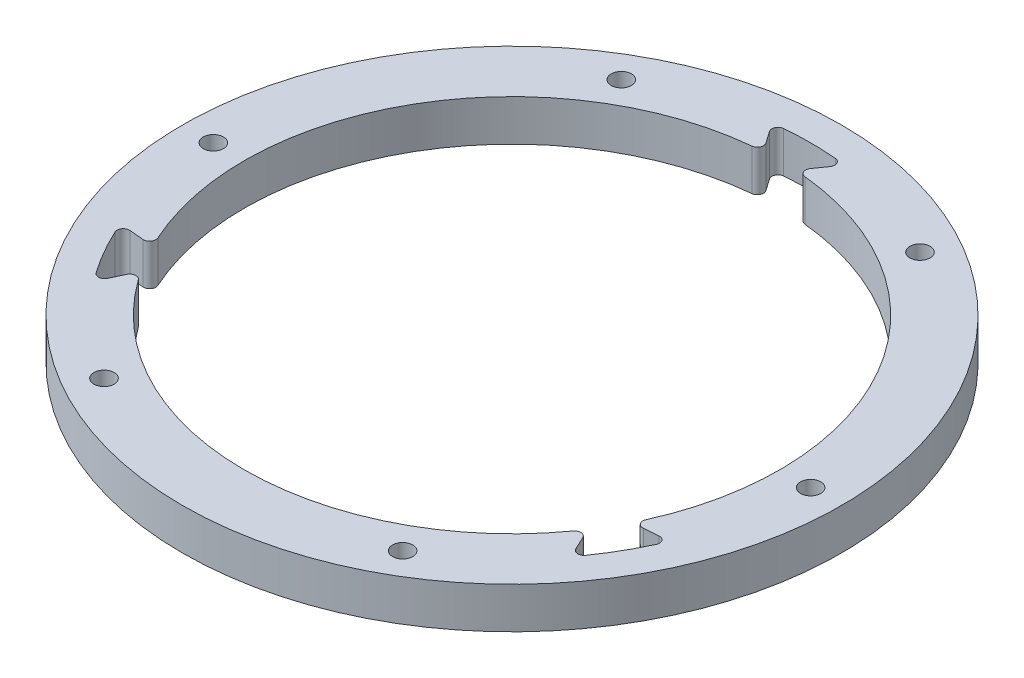
ISO-10303-21;
HEADER;
FILE_DESCRIPTION(('STEP AP214'),'2;1');
FILE_NAME('part.step','',(''),(''),'','','');
FILE_SCHEMA(('AUTOMOTIVE_DESIGN { 1 0 10303 214 1 1 1 1 }'));
ENDSEC;
DATA;
#1=APPLICATION_CONTEXT('core data for automotive mechanical design processes');
#2=APPLICATION_PROTOCOL_DEFINITION('international standard','automotive_design',2000,#1);
#3=PRODUCT_CONTEXT('',#1,'mechanical');
#4=PRODUCT('Part','Part','',(#3));
#5=PRODUCT_RELATED_PRODUCT_CATEGORY('part','',(#4));
#6=PRODUCT_DEFINITION_FORMATION('','',#4);
#7=PRODUCT_DEFINITION_CONTEXT('part definition',#1,'design');
#8=PRODUCT_DEFINITION('design','',#6,#7);
#9=PRODUCT_DEFINITION_SHAPE('','',#8);
#10=(LENGTH_UNIT() NAMED_UNIT(*) SI_UNIT(.MILLI.,.METRE.));
#11=(NAMED_UNIT(*) PLANE_ANGLE_UNIT() SI_UNIT($,.RADIAN.));
#12=(NAMED_UNIT(*) SI_UNIT($,.STERADIAN.) SOLID_ANGLE_UNIT());
#13=UNCERTAINTY_MEASURE_WITH_UNIT(LENGTH_MEASURE(1.E-05),#10,'distance_accuracy_value','');
#14=(GEOMETRIC_REPRESENTATION_CONTEXT(3) GLOBAL_UNCERTAINTY_ASSIGNED_CONTEXT((#13)) GLOBAL_UNIT_ASSIGNED_CONTEXT((#10,
#11,#12)) REPRESENTATION_CONTEXT('',''));
#15=CARTESIAN_POINT('',(0.,0.,0.));
#16=DIRECTION('',(0.,0.,1.));
#17=DIRECTION('',(1.,0.,0.));
#18=AXIS2_PLACEMENT_3D('',#15,#16,#17);
#19=CARTESIAN_POINT('',(0.,10.,80.));
#20=DIRECTION('',(0.,-1.,0.));
#21=DIRECTION('',(0.,0.,-1.));
#22=AXIS2_PLACEMENT_3D('',#19,#20,#21);
#23=PLANE('',#22);
#24=CARTESIAN_POINT('',(-36.2500000000001,10.,-62.7868417743718));
#25=DIRECTION('',(0.,1.,0.));
#26=DIRECTION('',(0.,0.,1.));
#27=AXIS2_PLACEMENT_3D('',#24,#25,#26);
#28=CIRCLE('',#27,2.45744999999999);
#29=CARTESIAN_POINT('',(-36.2500000000001,10.,-60.3293917743718));
#30=VERTEX_POINT('',#29);
#31=EDGE_CURVE('E769',#30,#30,#28,.T.);
#32=ORIENTED_EDGE('',*,*,#31,.F.);
#33=EDGE_LOOP('',(#32));
#34=FACE_BOUND('',#33,.T.);
#35=CARTESIAN_POINT('',(0.,10.,0.));
#36=DIRECTION('',(0.,-1.,0.));
#37=DIRECTION('',(0.,0.,-1.));
#38=AXIS2_PLACEMENT_3D('',#35,#36,#37);
#39=CIRCLE('',#38,80.);
#40=CARTESIAN_POINT('',(0.,10.,-80.));
#41=VERTEX_POINT('',#40);
#42=EDGE_CURVE('E241',#41,#41,#39,.T.);
#43=ORIENTED_EDGE('',*,*,#42,.F.);
#44=EDGE_LOOP('',(#43));
#45=FACE_BOUND('',#44,.T.);
#46=DIRECTION('',(0.422618261740713,0.,0.906307787036644));
#47=VECTOR('',#46,1.);
#48=CARTESIAN_POINT('',(57.9010744784291,10.,43.631589178523));
#49=LINE('',#48,#47);
#50=CARTESIAN_POINT('',(55.3581681828402,10.,38.1783090294255));
#51=VERTEX_POINT('',#50);
#52=CARTESIAN_POINT('',(56.8246262874602,10.,41.3231385834203));
#53=VERTEX_POINT('',#52);
#54=EDGE_CURVE('E359',#51,#53,#49,.T.);
#55=ORIENTED_EDGE('',*,*,#54,.F.);
#56=CARTESIAN_POINT('',(53.9987065022852,10.,38.8122364220365));
#57=DIRECTION('',(0.,-1.,0.));
#58=DIRECTION('',(0.,0.,-1.));
#59=AXIS2_PLACEMENT_3D('',#56,#57,#58);
#60=CIRCLE('',#59,1.5);
#61=CARTESIAN_POINT('',(52.7806905661435,10.,37.9367724425921));
#62=VERTEX_POINT('',#61);
#63=EDGE_CURVE('E324',#51,#62,#60,.F.);
#64=ORIENTED_EDGE('',*,*,#63,.T.);
#65=CARTESIAN_POINT('',(0.,10.,0.));
#66=DIRECTION('',(0.,-1.,0.));
#67=DIRECTION('',(0.,0.,-1.));
#68=AXIS2_PLACEMENT_3D('',#65,#66,#67);
#69=CIRCLE('',#68,65.);
#70=CARTESIAN_POINT('',(-52.7806905661429,10.,37.9367724425928));
#71=VERTEX_POINT('',#70);
#72=EDGE_CURVE('E242',#62,#71,#69,.T.);
#73=ORIENTED_EDGE('',*,*,#72,.T.);
#74=CARTESIAN_POINT('',(-53.9987065022847,10.,38.8122364220373));
#75=DIRECTION('',(0.,-1.,0.));
#76=DIRECTION('',(0.,0.,-1.));
#77=AXIS2_PLACEMENT_3D('',#74,#75,#76);
#78=CIRCLE('',#77,1.5);
#79=CARTESIAN_POINT('',(-55.3581681828397,10.,38.1783090294262));
#80=VERTEX_POINT('',#79);
#81=EDGE_CURVE('E285',#71,#80,#78,.F.);
#82=ORIENTED_EDGE('',*,*,#81,.T.);
#83=DIRECTION('',(0.4226182617407,0.,-0.90630778703665));
#84=VECTOR('',#83,1.);
#85=CARTESIAN_POINT('',(-54.2506339535424,10.,35.8031942099969));
#86=LINE('',#85,#84);
#87=CARTESIAN_POINT('',(-56.8246262874596,10.,41.3231385834211));
#88=VERTEX_POINT('',#87);
#89=EDGE_CURVE('E384',#88,#80,#86,.T.);
#90=ORIENTED_EDGE('',*,*,#89,.F.);
#91=CARTESIAN_POINT('',(-58.1840879680146,10.,40.68921119081));
#92=DIRECTION('',(0.,-1.,0.));
#93=DIRECTION('',(0.,0.,-1.));
#94=AXIS2_PLACEMENT_3D('',#91,#92,#93);
#95=CIRCLE('',#94,1.5);
#96=CARTESIAN_POINT('',(-59.4133292631135,10.,41.5488424131511));
#97=VERTEX_POINT('',#96);
#98=EDGE_CURVE('E313',#88,#97,#95,.T.);
#99=ORIENTED_EDGE('',*,*,#98,.T.);
#100=CARTESIAN_POINT('',(0.,10.,0.));
#101=DIRECTION('',(0.,1.,0.));
#102=DIRECTION('',(-0.866025403784436,0.,0.500000000000004));
#103=AXIS2_PLACEMENT_3D('',#100,#101,#102);
#104=CIRCLE('',#103,72.5);
#105=CARTESIAN_POINT('',(-65.6890176591816,10.,30.6790312586908));
#106=VERTEX_POINT('',#105);
#107=EDGE_CURVE('E371',#106,#97,#104,.T.);
#108=ORIENTED_EDGE('',*,*,#107,.F.);
#109=CARTESIAN_POINT('',(-64.3299345351986,10.,30.0442926809248));
#110=DIRECTION('',(0.,-1.,0.));
#111=DIRECTION('',(0.,0.,-1.));
#112=AXIS2_PLACEMENT_3D('',#109,#110,#111);
#113=CIRCLE('',#112,1.5);
#114=CARTESIAN_POINT('',(-64.1992009210771,10.,28.5500006337871));
#115=VERTEX_POINT('',#114);
#116=EDGE_CURVE('E309',#106,#115,#113,.T.);
#117=ORIENTED_EDGE('',*,*,#116,.T.);
#118=DIRECTION('',(-0.996194698091747,0.,-0.0871557427476483));
#119=VECTOR('',#118,1.);
#120=CARTESIAN_POINT('',(-66.7366018753018,10.,28.3280068154726));
#121=LINE('',#120,#119);
#122=CARTESIAN_POINT('',(-60.7424695844355,10.,28.8524254385981));
#123=VERTEX_POINT('',#122);
#124=EDGE_CURVE('E368',#123,#115,#121,.T.);
#125=ORIENTED_EDGE('',*,*,#124,.F.);
#126=CARTESIAN_POINT('',(-60.611735970314,10.,27.3581333914604));
#127=DIRECTION('',(0.,-1.,0.));
#128=DIRECTION('',(0.,0.,-1.));
#129=AXIS2_PLACEMENT_3D('',#126,#127,#128);
#130=CIRCLE('',#129,1.5);
#131=CARTESIAN_POINT('',(-59.244553955946,10.,26.7410326382696));
#132=VERTEX_POINT('',#131);
#133=EDGE_CURVE('E287',#123,#132,#130,.F.);
#134=ORIENTED_EDGE('',*,*,#133,.T.);
#135=CARTESIAN_POINT('',(-6.46386338980305,10.,-64.6778050808619));
#136=VERTEX_POINT('',#135);
#137=EDGE_CURVE('E243',#132,#136,#69,.T.);
#138=ORIENTED_EDGE('',*,*,#137,.T.);
#139=CARTESIAN_POINT('',(-6.61302946802927,10.,-66.1703698134972));
#140=DIRECTION('',(0.,-1.,0.));
#141=DIRECTION('',(0.,0.,-1.));
#142=AXIS2_PLACEMENT_3D('',#139,#140,#141);
#143=CIRCLE('',#142,1.5);
#144=CARTESIAN_POINT('',(-5.38430140159578,10.,-67.0307344680237));
#145=VERTEX_POINT('',#144);
#146=EDGE_CURVE('E208',#136,#145,#143,.F.);
#147=ORIENTED_EDGE('',*,*,#146,.T.);
#148=DIRECTION('',(0.573576436351042,0.,0.819152044288995));
#149=VECTOR('',#148,1.);
#150=CARTESIAN_POINT('',(-3.88115874571378,10.,-64.8840242801768));
#151=LINE('',#150,#149);
#152=CARTESIAN_POINT('',(-7.37457463361741,10.,-69.8731392172076));
#153=VERTEX_POINT('',#152);
#154=EDGE_CURVE('E228',#153,#145,#151,.T.);
#155=ORIENTED_EDGE('',*,*,#154,.F.);
#156=CARTESIAN_POINT('',(-6.14584656718391,10.,-70.7335038717342));
#157=DIRECTION('',(0.,-1.,0.));
#158=DIRECTION('',(0.,0.,-1.));
#159=AXIS2_PLACEMENT_3D('',#156,#157,#158);
#160=CIRCLE('',#159,1.5);
#161=CARTESIAN_POINT('',(-6.27568839606808,10.,-72.2278736718413));
#162=VERTEX_POINT('',#161);
#163=EDGE_CURVE('E276',#153,#162,#160,.T.);
#164=ORIENTED_EDGE('',*,*,#163,.T.);
#165=CARTESIAN_POINT('',(0.,10.,0.));
#166=DIRECTION('',(0.,1.,0.));
#167=DIRECTION('',(0.,0.,-1.));
#168=AXIS2_PLACEMENT_3D('',#165,#166,#167);
#169=CIRCLE('',#168,72.5);
#170=CARTESIAN_POINT('',(6.27568839606808,10.,-72.2278736718413));
#171=VERTEX_POINT('',#170);
#172=EDGE_CURVE('E224',#171,#162,#169,.T.);
#173=ORIENTED_EDGE('',*,*,#172,.F.);
#174=CARTESIAN_POINT('',(6.14584656718391,10.,-70.7335038717342));
#175=DIRECTION('',(0.,-1.,0.));
#176=DIRECTION('',(0.,0.,-1.));
#177=AXIS2_PLACEMENT_3D('',#174,#175,#176);
#178=CIRCLE('',#177,1.5);
#179=CARTESIAN_POINT('',(7.37457463361741,10.,-69.8731392172076));
#180=VERTEX_POINT('',#179);
#181=EDGE_CURVE('E223',#171,#180,#178,.T.);
#182=ORIENTED_EDGE('',*,*,#181,.T.);
#183=DIRECTION('',(0.573576436351042,0.,-0.819152044288995));
#184=VECTOR('',#183,1.);
#185=CARTESIAN_POINT('',(8.83552739687324,10.,-71.9595959939959));
#186=LINE('',#185,#184);
#187=CARTESIAN_POINT('',(5.38430140159578,10.,-67.0307344680237));
#188=VERTEX_POINT('',#187);
#189=EDGE_CURVE('E214',#188,#180,#186,.T.);
#190=ORIENTED_EDGE('',*,*,#189,.F.);
#191=CARTESIAN_POINT('',(6.61302946802927,10.,-66.1703698134972));
#192=DIRECTION('',(0.,-1.,0.));
#193=DIRECTION('',(0.,0.,-1.));
#194=AXIS2_PLACEMENT_3D('',#191,#192,#193);
#195=CIRCLE('',#194,1.5);
#196=CARTESIAN_POINT('',(6.46386338980305,10.,-64.6778050808619));
#197=VERTEX_POINT('',#196);
#198=EDGE_CURVE('E197',#188,#197,#195,.F.);
#199=ORIENTED_EDGE('',*,*,#198,.T.);
#200=CARTESIAN_POINT('',(59.2445539559464,10.,26.7410326382688));
#201=VERTEX_POINT('',#200);
#202=EDGE_CURVE('E239',#197,#201,#69,.T.);
#203=ORIENTED_EDGE('',*,*,#202,.T.);
#204=CARTESIAN_POINT('',(60.6117359703144,10.,27.3581333914596));
#205=DIRECTION('',(0.,-1.,0.));
#206=DIRECTION('',(0.,0.,-1.));
#207=AXIS2_PLACEMENT_3D('',#204,#205,#206);
#208=CIRCLE('',#207,1.5);
#209=CARTESIAN_POINT('',(60.7424695844359,10.,28.8524254385972));
#210=VERTEX_POINT('',#209);
#211=EDGE_CURVE('E322',#201,#210,#208,.F.);
#212=ORIENTED_EDGE('',*,*,#211,.T.);
#213=DIRECTION('',(-0.996194698091745,0.,0.0871557427476622));
#214=VECTOR('',#213,1.);
#215=CARTESIAN_POINT('',(58.1317926992566,10.,29.0808300701796));
#216=LINE('',#215,#214);
#217=CARTESIAN_POINT('',(64.1992009210775,10.,28.5500006337862));
#218=VERTEX_POINT('',#217);
#219=EDGE_CURVE('E350',#218,#210,#216,.T.);
#220=ORIENTED_EDGE('',*,*,#219,.F.);
#221=CARTESIAN_POINT('',(64.329934535199,10.,30.0442926809239));
#222=DIRECTION('',(0.,-1.,0.));
#223=DIRECTION('',(0.,0.,-1.));
#224=AXIS2_PLACEMENT_3D('',#221,#222,#223);
#225=CIRCLE('',#224,1.5);
#226=CARTESIAN_POINT('',(65.6890176591821,10.,30.6790312586899));
#227=VERTEX_POINT('',#226);
#228=EDGE_CURVE('E42',#218,#227,#225,.T.);
#229=ORIENTED_EDGE('',*,*,#228,.T.);
#230=CARTESIAN_POINT('',(0.,10.,0.));
#231=DIRECTION('',(0.,1.,0.));
#232=DIRECTION('',(0.866025403784443,0.,0.499999999999992));
#233=AXIS2_PLACEMENT_3D('',#230,#231,#232);
#234=CIRCLE('',#233,72.5);
#235=CARTESIAN_POINT('',(59.4133292631141,10.,41.5488424131503));
#236=VERTEX_POINT('',#235);
#237=EDGE_CURVE('E349',#236,#227,#234,.T.);
#238=ORIENTED_EDGE('',*,*,#237,.F.);
#239=CARTESIAN_POINT('',(58.1840879680152,10.,40.6892111908092));
#240=DIRECTION('',(0.,-1.,0.));
#241=DIRECTION('',(0.,0.,-1.));
#242=AXIS2_PLACEMENT_3D('',#239,#240,#241);
#243=CIRCLE('',#242,1.5);
#244=EDGE_CURVE('E343',#236,#53,#243,.T.);
#245=ORIENTED_EDGE('',*,*,#244,.T.);
#246=EDGE_LOOP('',(#55,#64,#73,#82,#90,#99,#108,#117,#125,#134,#138,#147,#155,#164,#173,#182,
#190,#199,#203,#212,#220,#229,#238,#245));
#247=FACE_BOUND('',#246,.T.);
#248=CARTESIAN_POINT('',(-72.5,10.,2.63677968348475E-13));
#249=DIRECTION('',(0.,1.,0.));
#250=DIRECTION('',(0.,0.,1.));
#251=AXIS2_PLACEMENT_3D('',#248,#249,#250);
#252=CIRCLE('',#251,2.45744999999999);
#253=CARTESIAN_POINT('',(-72.5,10.,2.45745000000025));
#254=VERTEX_POINT('',#253);
#255=EDGE_CURVE('E775',#254,#254,#252,.T.);
#256=ORIENTED_EDGE('',*,*,#255,.F.);
#257=EDGE_LOOP('',(#256));
#258=FACE_BOUND('',#257,.T.);
#259=CARTESIAN_POINT('',(-36.2499999999996,10.,62.786841774372));
#260=DIRECTION('',(0.,1.,0.));
#261=DIRECTION('',(0.,0.,1.));
#262=AXIS2_PLACEMENT_3D('',#259,#260,#261);
#263=CIRCLE('',#262,2.45744999999999);
#264=CARTESIAN_POINT('',(-36.2499999999996,10.,65.244291774372));
#265=VERTEX_POINT('',#264);
#266=EDGE_CURVE('E781',#265,#265,#263,.T.);
#267=ORIENTED_EDGE('',*,*,#266,.F.);
#268=EDGE_LOOP('',(#267));
#269=FACE_BOUND('',#268,.T.);
#270=CARTESIAN_POINT('',(36.2500000000001,10.,62.7868417743718));
#271=DIRECTION('',(0.,1.,0.));
#272=DIRECTION('',(0.,0.,1.));
#273=AXIS2_PLACEMENT_3D('',#270,#271,#272);
#274=CIRCLE('',#273,2.45744999999999);
#275=CARTESIAN_POINT('',(36.2500000000001,10.,65.2442917743717));
#276=VERTEX_POINT('',#275);
#277=EDGE_CURVE('E787',#276,#276,#274,.T.);
#278=ORIENTED_EDGE('',*,*,#277,.F.);
#279=EDGE_LOOP('',(#278));
#280=FACE_BOUND('',#279,.T.);
#281=CARTESIAN_POINT('',(72.5,10.,-7.70217223333702E-13));
#282=DIRECTION('',(0.,1.,0.));
#283=DIRECTION('',(0.,0.,1.));
#284=AXIS2_PLACEMENT_3D('',#281,#282,#283);
#285=CIRCLE('',#284,2.45744999999999);
#286=CARTESIAN_POINT('',(72.5,10.,2.45744999999922));
#287=VERTEX_POINT('',#286);
#288=EDGE_CURVE('E793',#287,#287,#285,.T.);
#289=ORIENTED_EDGE('',*,*,#288,.F.);
#290=EDGE_LOOP('',(#289));
#291=FACE_BOUND('',#290,.T.);
#292=CARTESIAN_POINT('',(36.2499999999992,10.,-62.7868417743723));
#293=DIRECTION('',(0.,1.,0.));
#294=DIRECTION('',(0.,0.,1.));
#295=AXIS2_PLACEMENT_3D('',#292,#293,#294);
#296=CIRCLE('',#295,2.45744999999999);
#297=CARTESIAN_POINT('',(36.2499999999992,10.,-60.3293917743723));
#298=VERTEX_POINT('',#297);
#299=EDGE_CURVE('E799',#298,#298,#296,.T.);
#300=ORIENTED_EDGE('',*,*,#299,.F.);
#301=EDGE_LOOP('',(#300));
#302=FACE_BOUND('',#301,.T.);
#303=ADVANCED_FACE('F34',(#34,#45,#247,#258,#269,#280,#291,#302),#23,.F.);
#304=CARTESIAN_POINT('',(0.,-0.750000000000001,0.));
#305=DIRECTION('',(0.,-1.,0.));
#306=DIRECTION('',(0.,0.,-1.));
#307=AXIS2_PLACEMENT_3D('',#304,#305,#306);
#308=CYLINDRICAL_SURFACE('',#307,65.);
#309=CARTESIAN_POINT('',(0.,0.,0.));
#310=DIRECTION('',(0.,-1.,0.));
#311=DIRECTION('',(0.,0.,-1.));
#312=AXIS2_PLACEMENT_3D('',#309,#310,#311);
#313=CIRCLE('',#312,65.);
#314=CARTESIAN_POINT('',(6.46386338980305,0.,-64.6778050808619));
#315=VERTEX_POINT('',#314);
#316=CARTESIAN_POINT('',(59.2445539559464,0.,26.7410326382688));
#317=VERTEX_POINT('',#316);
#318=EDGE_CURVE('E250',#315,#317,#313,.T.);
#319=ORIENTED_EDGE('',*,*,#318,.T.);
#320=DIRECTION('',(0.,-1.,0.));
#321=VECTOR('',#320,1.);
#322=CARTESIAN_POINT('',(59.2445539559464,-0.750000000000001,26.7410326382688));
#323=LINE('',#322,#321);
#324=EDGE_CURVE('E331',#317,#201,#323,.F.);
#325=ORIENTED_EDGE('',*,*,#324,.T.);
#326=ORIENTED_EDGE('',*,*,#202,.F.);
#327=DIRECTION('',(0.,-1.,0.));
#328=VECTOR('',#327,1.);
#329=CARTESIAN_POINT('',(6.46386338980305,-0.750000000000001,-64.6778050808619));
#330=LINE('',#329,#328);
#331=EDGE_CURVE('E202',#197,#315,#330,.T.);
#332=ORIENTED_EDGE('',*,*,#331,.T.);
#333=EDGE_LOOP('',(#319,#325,#326,#332));
#334=FACE_BOUND('',#333,.T.);
#335=ADVANCED_FACE('F460',(#334),#308,.F.);
#336=ORIENTED_EDGE('',*,*,#72,.F.);
#337=DIRECTION('',(0.,-1.,0.));
#338=VECTOR('',#337,1.);
#339=CARTESIAN_POINT('',(52.7806905661435,-0.750000000000001,37.9367724425921));
#340=LINE('',#339,#338);
#341=CARTESIAN_POINT('',(52.7806905661435,0.,37.9367724425921));
#342=VERTEX_POINT('',#341);
#343=EDGE_CURVE('E326',#62,#342,#340,.T.);
#344=ORIENTED_EDGE('',*,*,#343,.T.);
#345=CARTESIAN_POINT('',(-52.7806905661429,0.,37.9367724425928));
#346=VERTEX_POINT('',#345);
#347=EDGE_CURVE('E252',#342,#346,#313,.T.);
#348=ORIENTED_EDGE('',*,*,#347,.T.);
#349=DIRECTION('',(0.,-1.,0.));
#350=VECTOR('',#349,1.);
#351=CARTESIAN_POINT('',(-52.7806905661429,-0.750000000000001,37.9367724425928));
#352=LINE('',#351,#350);
#353=EDGE_CURVE('E296',#346,#71,#352,.F.);
#354=ORIENTED_EDGE('',*,*,#353,.T.);
#355=EDGE_LOOP('',(#336,#344,#348,#354));
#356=FACE_BOUND('',#355,.T.);
#357=ADVANCED_FACE('F410',(#356),#308,.F.);
#358=ORIENTED_EDGE('',*,*,#137,.F.);
#359=DIRECTION('',(0.,-1.,0.));
#360=VECTOR('',#359,1.);
#361=CARTESIAN_POINT('',(-59.244553955946,-0.750000000000001,26.7410326382696));
#362=LINE('',#361,#360);
#363=CARTESIAN_POINT('',(-59.244553955946,0.,26.7410326382696));
#364=VERTEX_POINT('',#363);
#365=EDGE_CURVE('E289',#132,#364,#362,.T.);
#366=ORIENTED_EDGE('',*,*,#365,.T.);
#367=CARTESIAN_POINT('',(-6.46386338980305,0.,-64.6778050808619));
#368=VERTEX_POINT('',#367);
#369=EDGE_CURVE('E249',#364,#368,#313,.T.);
#370=ORIENTED_EDGE('',*,*,#369,.T.);
#371=DIRECTION('',(0.,-1.,0.));
#372=VECTOR('',#371,1.);
#373=CARTESIAN_POINT('',(-6.46386338980305,-0.750000000000001,-64.6778050808619));
#374=LINE('',#373,#372);
#375=EDGE_CURVE('E207',#368,#136,#374,.F.);
#376=ORIENTED_EDGE('',*,*,#375,.T.);
#377=EDGE_LOOP('',(#358,#366,#370,#376));
#378=FACE_BOUND('',#377,.T.);
#379=ADVANCED_FACE('F439',(#378),#308,.F.);
#380=CARTESIAN_POINT('',(0.,0.,65.));
#381=DIRECTION('',(0.,1.,0.));
#382=DIRECTION('',(0.,0.,1.));
#383=AXIS2_PLACEMENT_3D('',#380,#381,#382);
#384=PLANE('',#383);
#385=CARTESIAN_POINT('',(36.2499999999992,0.,-62.7868417743723));
#386=DIRECTION('',(0.,1.,0.));
#387=DIRECTION('',(0.,0.,1.));
#388=AXIS2_PLACEMENT_3D('',#385,#386,#387);
#389=CIRCLE('',#388,2.45745);
#390=CARTESIAN_POINT('',(36.2499999999992,0.,-60.3293917743723));
#391=VERTEX_POINT('',#390);
#392=EDGE_CURVE('E796',#391,#391,#389,.T.);
#393=ORIENTED_EDGE('',*,*,#392,.T.);
#394=EDGE_LOOP('',(#393));
#395=FACE_BOUND('',#394,.T.);
#396=CARTESIAN_POINT('',(72.5,0.,-7.70217223333702E-13));
#397=DIRECTION('',(0.,1.,0.));
#398=DIRECTION('',(0.,0.,1.));
#399=AXIS2_PLACEMENT_3D('',#396,#397,#398);
#400=CIRCLE('',#399,2.45745);
#401=CARTESIAN_POINT('',(72.5,0.,2.45744999999923));
#402=VERTEX_POINT('',#401);
#403=EDGE_CURVE('E790',#402,#402,#400,.T.);
#404=ORIENTED_EDGE('',*,*,#403,.T.);
#405=EDGE_LOOP('',(#404));
#406=FACE_BOUND('',#405,.T.);
#407=CARTESIAN_POINT('',(36.2500000000001,0.,62.7868417743718));
#408=DIRECTION('',(0.,1.,0.));
#409=DIRECTION('',(0.,0.,1.));
#410=AXIS2_PLACEMENT_3D('',#407,#408,#409);
#411=CIRCLE('',#410,2.45745);
#412=CARTESIAN_POINT('',(36.2500000000001,0.,65.2442917743718));
#413=VERTEX_POINT('',#412);
#414=EDGE_CURVE('E784',#413,#413,#411,.T.);
#415=ORIENTED_EDGE('',*,*,#414,.T.);
#416=EDGE_LOOP('',(#415));
#417=FACE_BOUND('',#416,.T.);
#418=CARTESIAN_POINT('',(-36.2499999999996,0.,62.786841774372));
#419=DIRECTION('',(0.,1.,0.));
#420=DIRECTION('',(0.,0.,1.));
#421=AXIS2_PLACEMENT_3D('',#418,#419,#420);
#422=CIRCLE('',#421,2.45745);
#423=CARTESIAN_POINT('',(-36.2499999999996,0.,65.244291774372));
#424=VERTEX_POINT('',#423);
#425=EDGE_CURVE('E778',#424,#424,#422,.T.);
#426=ORIENTED_EDGE('',*,*,#425,.T.);
#427=EDGE_LOOP('',(#426));
#428=FACE_BOUND('',#427,.T.);
#429=CARTESIAN_POINT('',(-72.5,0.,2.63677968348475E-13));
#430=DIRECTION('',(0.,1.,0.));
#431=DIRECTION('',(0.,0.,1.));
#432=AXIS2_PLACEMENT_3D('',#429,#430,#431);
#433=CIRCLE('',#432,2.45745);
#434=CARTESIAN_POINT('',(-72.5,0.,2.45745000000026));
#435=VERTEX_POINT('',#434);
#436=EDGE_CURVE('E772',#435,#435,#433,.T.);
#437=ORIENTED_EDGE('',*,*,#436,.T.);
#438=EDGE_LOOP('',(#437));
#439=FACE_BOUND('',#438,.T.);
#440=CARTESIAN_POINT('',(-36.2500000000001,0.,-62.7868417743718));
#441=DIRECTION('',(0.,1.,0.));
#442=DIRECTION('',(0.,0.,1.));
#443=AXIS2_PLACEMENT_3D('',#440,#441,#442);
#444=CIRCLE('',#443,2.45745);
#445=CARTESIAN_POINT('',(-36.2500000000001,0.,-60.3293917743718));
#446=VERTEX_POINT('',#445);
#447=EDGE_CURVE('E378',#446,#446,#444,.T.);
#448=ORIENTED_EDGE('',*,*,#447,.T.);
#449=EDGE_LOOP('',(#448));
#450=FACE_BOUND('',#449,.T.);
#451=ORIENTED_EDGE('',*,*,#347,.F.);
#452=CARTESIAN_POINT('',(53.9987065022852,0.,38.8122364220365));
#453=DIRECTION('',(0.,1.,0.));
#454=DIRECTION('',(0.,0.,1.));
#455=AXIS2_PLACEMENT_3D('',#452,#453,#454);
#456=CIRCLE('',#455,1.5);
#457=CARTESIAN_POINT('',(55.3581681828402,0.,38.1783090294255));
#458=VERTEX_POINT('',#457);
#459=EDGE_CURVE('E329',#342,#458,#456,.F.);
#460=ORIENTED_EDGE('',*,*,#459,.T.);
#461=DIRECTION('',(0.422618261740713,0.,0.906307787036644));
#462=VECTOR('',#461,1.);
#463=CARTESIAN_POINT('',(57.9010744784291,0.,43.631589178523));
#464=LINE('',#463,#462);
#465=CARTESIAN_POINT('',(56.8246262874602,0.,41.3231385834203));
#466=VERTEX_POINT('',#465);
#467=EDGE_CURVE('E373',#458,#466,#464,.T.);
#468=ORIENTED_EDGE('',*,*,#467,.T.);
#469=CARTESIAN_POINT('',(58.1840879680152,0.,40.6892111908092));
#470=DIRECTION('',(0.,1.,0.));
#471=DIRECTION('',(0.,0.,1.));
#472=AXIS2_PLACEMENT_3D('',#469,#470,#471);
#473=CIRCLE('',#472,1.5);
#474=CARTESIAN_POINT('',(59.4133292631141,0.,41.5488424131503));
#475=VERTEX_POINT('',#474);
#476=EDGE_CURVE('E345',#466,#475,#473,.T.);
#477=ORIENTED_EDGE('',*,*,#476,.T.);
#478=CARTESIAN_POINT('',(0.,0.,0.));
#479=DIRECTION('',(0.,1.,0.));
#480=DIRECTION('',(0.866025403784443,0.,0.499999999999992));
#481=AXIS2_PLACEMENT_3D('',#478,#479,#480);
#482=CIRCLE('',#481,72.5);
#483=CARTESIAN_POINT('',(65.6890176591821,0.,30.6790312586899));
#484=VERTEX_POINT('',#483);
#485=EDGE_CURVE('E366',#475,#484,#482,.T.);
#486=ORIENTED_EDGE('',*,*,#485,.T.);
#487=CARTESIAN_POINT('',(64.329934535199,0.,30.0442926809239));
#488=DIRECTION('',(0.,1.,0.));
#489=DIRECTION('',(0.,0.,1.));
#490=AXIS2_PLACEMENT_3D('',#487,#488,#489);
#491=CIRCLE('',#490,1.5);
#492=CARTESIAN_POINT('',(64.1992009210775,0.,28.5500006337862));
#493=VERTEX_POINT('',#492);
#494=EDGE_CURVE('E11',#484,#493,#491,.T.);
#495=ORIENTED_EDGE('',*,*,#494,.T.);
#496=DIRECTION('',(-0.996194698091745,0.,0.0871557427476622));
#497=VECTOR('',#496,1.);
#498=CARTESIAN_POINT('',(58.1317926992566,0.,29.0808300701796));
#499=LINE('',#498,#497);
#500=CARTESIAN_POINT('',(60.7424695844359,0.,28.8524254385972));
#501=VERTEX_POINT('',#500);
#502=EDGE_CURVE('E365',#493,#501,#499,.T.);
#503=ORIENTED_EDGE('',*,*,#502,.T.);
#504=CARTESIAN_POINT('',(60.6117359703144,0.,27.3581333914596));
#505=DIRECTION('',(0.,1.,0.));
#506=DIRECTION('',(0.,0.,1.));
#507=AXIS2_PLACEMENT_3D('',#504,#505,#506);
#508=CIRCLE('',#507,1.5);
#509=EDGE_CURVE('E49',#501,#317,#508,.F.);
#510=ORIENTED_EDGE('',*,*,#509,.T.);
#511=ORIENTED_EDGE('',*,*,#318,.F.);
#512=CARTESIAN_POINT('',(6.61302946802927,0.,-66.1703698134972));
#513=DIRECTION('',(0.,1.,0.));
#514=DIRECTION('',(0.,0.,1.));
#515=AXIS2_PLACEMENT_3D('',#512,#513,#514);
#516=CIRCLE('',#515,1.5);
#517=CARTESIAN_POINT('',(5.38430140159578,0.,-67.0307344680237));
#518=VERTEX_POINT('',#517);
#519=EDGE_CURVE('E261',#315,#518,#516,.F.);
#520=ORIENTED_EDGE('',*,*,#519,.T.);
#521=DIRECTION('',(0.573576436351042,0.,-0.819152044288995));
#522=VECTOR('',#521,1.);
#523=CARTESIAN_POINT('',(8.83552739687324,0.,-71.9595959939959));
#524=LINE('',#523,#522);
#525=CARTESIAN_POINT('',(7.37457463361741,0.,-69.8731392172076));
#526=VERTEX_POINT('',#525);
#527=EDGE_CURVE('E217',#518,#526,#524,.T.);
#528=ORIENTED_EDGE('',*,*,#527,.T.);
#529=CARTESIAN_POINT('',(6.14584656718391,0.,-70.7335038717342));
#530=DIRECTION('',(0.,1.,0.));
#531=DIRECTION('',(0.,0.,1.));
#532=AXIS2_PLACEMENT_3D('',#529,#530,#531);
#533=CIRCLE('',#532,1.5);
#534=CARTESIAN_POINT('',(6.27568839606808,0.,-72.2278736718413));
#535=VERTEX_POINT('',#534);
#536=EDGE_CURVE('E274',#526,#535,#533,.T.);
#537=ORIENTED_EDGE('',*,*,#536,.T.);
#538=CARTESIAN_POINT('',(0.,0.,0.));
#539=DIRECTION('',(0.,1.,0.));
#540=DIRECTION('',(0.,0.,-1.));
#541=AXIS2_PLACEMENT_3D('',#538,#539,#540);
#542=CIRCLE('',#541,72.5);
#543=CARTESIAN_POINT('',(-6.27568839606808,0.,-72.2278736718413));
#544=VERTEX_POINT('',#543);
#545=EDGE_CURVE('E391',#535,#544,#542,.T.);
#546=ORIENTED_EDGE('',*,*,#545,.T.);
#547=CARTESIAN_POINT('',(-6.14584656718391,0.,-70.7335038717342));
#548=DIRECTION('',(0.,1.,0.));
#549=DIRECTION('',(0.,0.,1.));
#550=AXIS2_PLACEMENT_3D('',#547,#548,#549);
#551=CIRCLE('',#550,1.5);
#552=CARTESIAN_POINT('',(-7.37457463361741,0.,-69.8731392172076));
#553=VERTEX_POINT('',#552);
#554=EDGE_CURVE('E278',#544,#553,#551,.T.);
#555=ORIENTED_EDGE('',*,*,#554,.T.);
#556=DIRECTION('',(0.573576436351042,0.,0.819152044288995));
#557=VECTOR('',#556,1.);
#558=CARTESIAN_POINT('',(-3.88115874571378,0.,-64.8840242801768));
#559=LINE('',#558,#557);
#560=CARTESIAN_POINT('',(-5.38430140159578,0.,-67.0307344680237));
#561=VERTEX_POINT('',#560);
#562=EDGE_CURVE('E234',#553,#561,#559,.T.);
#563=ORIENTED_EDGE('',*,*,#562,.T.);
#564=CARTESIAN_POINT('',(-6.61302946802927,0.,-66.1703698134972));
#565=DIRECTION('',(0.,1.,0.));
#566=DIRECTION('',(0.,0.,1.));
#567=AXIS2_PLACEMENT_3D('',#564,#565,#566);
#568=CIRCLE('',#567,1.5);
#569=EDGE_CURVE('E258',#561,#368,#568,.F.);
#570=ORIENTED_EDGE('',*,*,#569,.T.);
#571=ORIENTED_EDGE('',*,*,#369,.F.);
#572=CARTESIAN_POINT('',(-60.611735970314,0.,27.3581333914604));
#573=DIRECTION('',(0.,1.,0.));
#574=DIRECTION('',(0.,0.,1.));
#575=AXIS2_PLACEMENT_3D('',#572,#573,#574);
#576=CIRCLE('',#575,1.5);
#577=CARTESIAN_POINT('',(-60.7424695844355,0.,28.8524254385981));
#578=VERTEX_POINT('',#577);
#579=EDGE_CURVE('E294',#364,#578,#576,.F.);
#580=ORIENTED_EDGE('',*,*,#579,.T.);
#581=DIRECTION('',(-0.996194698091747,0.,-0.0871557427476483));
#582=VECTOR('',#581,1.);
#583=CARTESIAN_POINT('',(-66.7366018753018,0.,28.3280068154726));
#584=LINE('',#583,#582);
#585=CARTESIAN_POINT('',(-64.1992009210771,0.,28.5500006337871));
#586=VERTEX_POINT('',#585);
#587=EDGE_CURVE('E381',#578,#586,#584,.T.);
#588=ORIENTED_EDGE('',*,*,#587,.T.);
#589=CARTESIAN_POINT('',(-64.3299345351986,0.,30.0442926809248));
#590=DIRECTION('',(0.,1.,0.));
#591=DIRECTION('',(0.,0.,1.));
#592=AXIS2_PLACEMENT_3D('',#589,#590,#591);
#593=CIRCLE('',#592,1.5);
#594=CARTESIAN_POINT('',(-65.6890176591816,0.,30.6790312586908));
#595=VERTEX_POINT('',#594);
#596=EDGE_CURVE('E311',#586,#595,#593,.T.);
#597=ORIENTED_EDGE('',*,*,#596,.T.);
#598=CARTESIAN_POINT('',(0.,0.,0.));
#599=DIRECTION('',(0.,1.,0.));
#600=DIRECTION('',(-0.866025403784436,0.,0.500000000000004));
#601=AXIS2_PLACEMENT_3D('',#598,#599,#600);
#602=CIRCLE('',#601,72.5);
#603=CARTESIAN_POINT('',(-59.4133292631135,0.,41.5488424131511));
#604=VERTEX_POINT('',#603);
#605=EDGE_CURVE('E231',#595,#604,#602,.T.);
#606=ORIENTED_EDGE('',*,*,#605,.T.);
#607=CARTESIAN_POINT('',(-58.1840879680146,0.,40.68921119081));
#608=DIRECTION('',(0.,1.,0.));
#609=DIRECTION('',(0.,0.,1.));
#610=AXIS2_PLACEMENT_3D('',#607,#608,#609);
#611=CIRCLE('',#610,1.5);
#612=CARTESIAN_POINT('',(-56.8246262874596,0.,41.3231385834211));
#613=VERTEX_POINT('',#612);
#614=EDGE_CURVE('E315',#604,#613,#611,.T.);
#615=ORIENTED_EDGE('',*,*,#614,.T.);
#616=DIRECTION('',(0.4226182617407,0.,-0.90630778703665));
#617=VECTOR('',#616,1.);
#618=CARTESIAN_POINT('',(-54.2506339535424,0.,35.8031942099969));
#619=LINE('',#618,#617);
#620=CARTESIAN_POINT('',(-55.3581681828397,0.,38.1783090294262));
#621=VERTEX_POINT('',#620);
#622=EDGE_CURVE('E225',#613,#621,#619,.T.);
#623=ORIENTED_EDGE('',*,*,#622,.T.);
#624=CARTESIAN_POINT('',(-53.9987065022847,0.,38.8122364220373));
#625=DIRECTION('',(0.,1.,0.));
#626=DIRECTION('',(0.,0.,1.));
#627=AXIS2_PLACEMENT_3D('',#624,#625,#626);
#628=CIRCLE('',#627,1.5);
#629=EDGE_CURVE('E291',#621,#346,#628,.F.);
#630=ORIENTED_EDGE('',*,*,#629,.T.);
#631=EDGE_LOOP('',(#451,#460,#468,#477,#486,#495,#503,#510,#511,#520,#528,#537,#546,#555,#563,
#570,#571,#580,#588,#597,#606,#615,#623,#630));
#632=FACE_BOUND('',#631,.T.);
#633=CARTESIAN_POINT('',(0.,0.,0.));
#634=DIRECTION('',(0.,-1.,0.));
#635=DIRECTION('',(0.,0.,-1.));
#636=AXIS2_PLACEMENT_3D('',#633,#634,#635);
#637=CIRCLE('',#636,80.);
#638=CARTESIAN_POINT('',(0.,0.,-80.));
#639=VERTEX_POINT('',#638);
#640=EDGE_CURVE('E246',#639,#639,#637,.T.);
#641=ORIENTED_EDGE('',*,*,#640,.T.);
#642=EDGE_LOOP('',(#641));
#643=FACE_BOUND('',#642,.T.);
#644=ADVANCED_FACE('F363',(#395,#406,#417,#428,#439,#450,#632,#643),#384,.F.);
#645=CARTESIAN_POINT('',(0.,-0.750000000000001,0.));
#646=DIRECTION('',(0.,-1.,0.));
#647=DIRECTION('',(0.,0.,-1.));
#648=AXIS2_PLACEMENT_3D('',#645,#646,#647);
#649=CYLINDRICAL_SURFACE('',#648,80.);
#650=ORIENTED_EDGE('',*,*,#640,.F.);
#651=EDGE_LOOP('',(#650));
#652=FACE_BOUND('',#651,.T.);
#653=ORIENTED_EDGE('',*,*,#42,.T.);
#654=EDGE_LOOP('',(#653));
#655=FACE_BOUND('',#654,.T.);
#656=ADVANCED_FACE('F486',(#652,#655),#649,.T.);
#657=CARTESIAN_POINT('',(-3.88115874571378,0.,-64.8840242801768));
#658=DIRECTION('',(-0.819152044288995,0.,0.573576436351042));
#659=DIRECTION('',(0.573576436351042,0.,0.819152044288995));
#660=AXIS2_PLACEMENT_3D('',#657,#658,#659);
#661=PLANE('',#660);
#662=ORIENTED_EDGE('',*,*,#154,.T.);
#663=DIRECTION('',(0.,-1.,0.));
#664=VECTOR('',#663,1.);
#665=CARTESIAN_POINT('',(-5.38430140159578,0.,-67.0307344680237));
#666=LINE('',#665,#664);
#667=EDGE_CURVE('E266',#145,#561,#666,.T.);
#668=ORIENTED_EDGE('',*,*,#667,.T.);
#669=ORIENTED_EDGE('',*,*,#562,.F.);
#670=DIRECTION('',(0.,-1.,0.));
#671=VECTOR('',#670,1.);
#672=CARTESIAN_POINT('',(-7.37457463361741,10.,-69.8731392172076));
#673=LINE('',#672,#671);
#674=EDGE_CURVE('E263',#553,#153,#673,.F.);
#675=ORIENTED_EDGE('',*,*,#674,.T.);
#676=EDGE_LOOP('',(#662,#668,#669,#675));
#677=FACE_BOUND('',#676,.T.);
#678=ADVANCED_FACE('F447',(#677),#661,.F.);
#679=CARTESIAN_POINT('',(0.,0.,0.));
#680=DIRECTION('',(0.,1.,0.));
#681=DIRECTION('',(0.,0.,1.));
#682=AXIS2_PLACEMENT_3D('',#679,#680,#681);
#683=CYLINDRICAL_SURFACE('',#682,72.5);
#684=ORIENTED_EDGE('',*,*,#545,.F.);
#685=DIRECTION('',(0.,1.,0.));
#686=VECTOR('',#685,1.);
#687=CARTESIAN_POINT('',(6.27568839606808,0.,-72.2278736718413));
#688=LINE('',#687,#686);
#689=EDGE_CURVE('E270',#535,#171,#688,.T.);
#690=ORIENTED_EDGE('',*,*,#689,.T.);
#691=ORIENTED_EDGE('',*,*,#172,.T.);
#692=DIRECTION('',(0.,1.,0.));
#693=VECTOR('',#692,1.);
#694=CARTESIAN_POINT('',(-6.27568839606808,0.,-72.2278736718413));
#695=LINE('',#694,#693);
#696=EDGE_CURVE('E268',#162,#544,#695,.F.);
#697=ORIENTED_EDGE('',*,*,#696,.T.);
#698=EDGE_LOOP('',(#684,#690,#691,#697));
#699=FACE_BOUND('',#698,.T.);
#700=ADVANCED_FACE('F453',(#699),#683,.F.);
#701=CARTESIAN_POINT('',(8.83552739687324,0.,-71.9595959939959));
#702=DIRECTION('',(0.819152044288995,0.,0.573576436351042));
#703=DIRECTION('',(0.573576436351042,0.,-0.819152044288995));
#704=AXIS2_PLACEMENT_3D('',#701,#702,#703);
#705=PLANE('',#704);
#706=ORIENTED_EDGE('',*,*,#527,.F.);
#707=DIRECTION('',(0.,-1.,0.));
#708=VECTOR('',#707,1.);
#709=CARTESIAN_POINT('',(5.38430140159578,0.,-67.0307344680237));
#710=LINE('',#709,#708);
#711=EDGE_CURVE('E201',#518,#188,#710,.F.);
#712=ORIENTED_EDGE('',*,*,#711,.T.);
#713=ORIENTED_EDGE('',*,*,#189,.T.);
#714=DIRECTION('',(0.,-1.,0.));
#715=VECTOR('',#714,1.);
#716=CARTESIAN_POINT('',(7.37457463361741,0.,-69.8731392172076));
#717=LINE('',#716,#715);
#718=EDGE_CURVE('E218',#180,#526,#717,.T.);
#719=ORIENTED_EDGE('',*,*,#718,.T.);
#720=EDGE_LOOP('',(#706,#712,#713,#719));
#721=FACE_BOUND('',#720,.T.);
#722=ADVANCED_FACE('F213',(#721),#705,.F.);
#723=CARTESIAN_POINT('',(6.61302946802927,-0.750000000000001,-66.1703698134972));
#724=DIRECTION('',(0.,-1.,0.));
#725=DIRECTION('',(0.,0.,-1.));
#726=AXIS2_PLACEMENT_3D('',#723,#724,#725);
#727=CYLINDRICAL_SURFACE('',#726,1.5);
#728=ORIENTED_EDGE('',*,*,#519,.F.);
#729=ORIENTED_EDGE('',*,*,#331,.F.);
#730=ORIENTED_EDGE('',*,*,#198,.F.);
#731=ORIENTED_EDGE('',*,*,#711,.F.);
#732=EDGE_LOOP('',(#728,#729,#730,#731));
#733=FACE_BOUND('',#732,.T.);
#734=ADVANCED_FACE('F200',(#733),#727,.T.);
#735=CARTESIAN_POINT('',(-6.61302946802927,-0.750000000000001,-66.1703698134972));
#736=DIRECTION('',(0.,-1.,0.));
#737=DIRECTION('',(0.,0.,-1.));
#738=AXIS2_PLACEMENT_3D('',#735,#736,#737);
#739=CYLINDRICAL_SURFACE('',#738,1.5);
#740=ORIENTED_EDGE('',*,*,#569,.F.);
#741=ORIENTED_EDGE('',*,*,#667,.F.);
#742=ORIENTED_EDGE('',*,*,#146,.F.);
#743=ORIENTED_EDGE('',*,*,#375,.F.);
#744=EDGE_LOOP('',(#740,#741,#742,#743));
#745=FACE_BOUND('',#744,.T.);
#746=ADVANCED_FACE('F443',(#745),#739,.T.);
#747=CARTESIAN_POINT('',(6.14584656718391,0.,-70.7335038717342));
#748=DIRECTION('',(0.,1.,0.));
#749=DIRECTION('',(0.,0.,1.));
#750=AXIS2_PLACEMENT_3D('',#747,#748,#749);
#751=CYLINDRICAL_SURFACE('',#750,1.5);
#752=ORIENTED_EDGE('',*,*,#536,.F.);
#753=ORIENTED_EDGE('',*,*,#718,.F.);
#754=ORIENTED_EDGE('',*,*,#181,.F.);
#755=ORIENTED_EDGE('',*,*,#689,.F.);
#756=EDGE_LOOP('',(#752,#753,#754,#755));
#757=FACE_BOUND('',#756,.T.);
#758=ADVANCED_FACE('F457',(#757),#751,.F.);
#759=CARTESIAN_POINT('',(-6.14584656718391,0.,-70.7335038717342));
#760=DIRECTION('',(0.,1.,0.));
#761=DIRECTION('',(0.,0.,1.));
#762=AXIS2_PLACEMENT_3D('',#759,#760,#761);
#763=CYLINDRICAL_SURFACE('',#762,1.5);
#764=ORIENTED_EDGE('',*,*,#554,.F.);
#765=ORIENTED_EDGE('',*,*,#696,.F.);
#766=ORIENTED_EDGE('',*,*,#163,.F.);
#767=ORIENTED_EDGE('',*,*,#674,.F.);
#768=EDGE_LOOP('',(#764,#765,#766,#767));
#769=FACE_BOUND('',#768,.T.);
#770=ADVANCED_FACE('F450',(#769),#763,.F.);
#771=CARTESIAN_POINT('',(-54.2506339535424,0.,35.8031942099969));
#772=DIRECTION('',(0.90630778703665,0.,0.4226182617407));
#773=DIRECTION('',(0.4226182617407,0.,-0.90630778703665));
#774=AXIS2_PLACEMENT_3D('',#771,#772,#773);
#775=PLANE('',#774);
#776=ORIENTED_EDGE('',*,*,#89,.T.);
#777=DIRECTION('',(0.,-1.,0.));
#778=VECTOR('',#777,1.);
#779=CARTESIAN_POINT('',(-55.3581681828397,0.,38.1783090294262));
#780=LINE('',#779,#778);
#781=EDGE_CURVE('E302',#80,#621,#780,.T.);
#782=ORIENTED_EDGE('',*,*,#781,.T.);
#783=ORIENTED_EDGE('',*,*,#622,.F.);
#784=DIRECTION('',(0.,-1.,0.));
#785=VECTOR('',#784,1.);
#786=CARTESIAN_POINT('',(-56.8246262874596,10.,41.3231385834211));
#787=LINE('',#786,#785);
#788=EDGE_CURVE('E299',#613,#88,#787,.F.);
#789=ORIENTED_EDGE('',*,*,#788,.T.);
#790=EDGE_LOOP('',(#776,#782,#783,#789));
#791=FACE_BOUND('',#790,.T.);
#792=ADVANCED_FACE('F416',(#791),#775,.F.);
#793=CARTESIAN_POINT('',(0.,0.,0.));
#794=DIRECTION('',(0.,1.,0.));
#795=DIRECTION('',(0.,0.,1.));
#796=AXIS2_PLACEMENT_3D('',#793,#794,#795);
#797=CYLINDRICAL_SURFACE('',#796,72.5);
#798=ORIENTED_EDGE('',*,*,#605,.F.);
#799=DIRECTION('',(0.,1.,0.));
#800=VECTOR('',#799,1.);
#801=CARTESIAN_POINT('',(-65.6890176591817,0.,30.6790312586908));
#802=LINE('',#801,#800);
#803=EDGE_CURVE('E306',#595,#106,#802,.T.);
#804=ORIENTED_EDGE('',*,*,#803,.T.);
#805=ORIENTED_EDGE('',*,*,#107,.T.);
#806=DIRECTION('',(0.,1.,0.));
#807=VECTOR('',#806,1.);
#808=CARTESIAN_POINT('',(-59.4133292631135,0.,41.5488424131511));
#809=LINE('',#808,#807);
#810=EDGE_CURVE('E304',#97,#604,#809,.F.);
#811=ORIENTED_EDGE('',*,*,#810,.T.);
#812=EDGE_LOOP('',(#798,#804,#805,#811));
#813=FACE_BOUND('',#812,.T.);
#814=ADVANCED_FACE('F423',(#813),#797,.F.);
#815=CARTESIAN_POINT('',(-66.7366018753018,0.,28.3280068154726));
#816=DIRECTION('',(0.0871557427476483,0.,-0.996194698091747));
#817=DIRECTION('',(-0.996194698091747,0.,-0.0871557427476483));
#818=AXIS2_PLACEMENT_3D('',#815,#816,#817);
#819=PLANE('',#818);
#820=ORIENTED_EDGE('',*,*,#587,.F.);
#821=DIRECTION('',(0.,-1.,0.));
#822=VECTOR('',#821,1.);
#823=CARTESIAN_POINT('',(-60.7424695844355,0.,28.8524254385981));
#824=LINE('',#823,#822);
#825=EDGE_CURVE('E282',#578,#123,#824,.F.);
#826=ORIENTED_EDGE('',*,*,#825,.T.);
#827=ORIENTED_EDGE('',*,*,#124,.T.);
#828=DIRECTION('',(0.,-1.,0.));
#829=VECTOR('',#828,1.);
#830=CARTESIAN_POINT('',(-64.1992009210771,0.,28.5500006337871));
#831=LINE('',#830,#829);
#832=EDGE_CURVE('E280',#115,#586,#831,.T.);
#833=ORIENTED_EDGE('',*,*,#832,.T.);
#834=EDGE_LOOP('',(#820,#826,#827,#833));
#835=FACE_BOUND('',#834,.T.);
#836=ADVANCED_FACE('F432',(#835),#819,.F.);
#837=CARTESIAN_POINT('',(58.1317926992566,0.,29.0808300701796));
#838=DIRECTION('',(-0.0871557427476622,0.,-0.996194698091745));
#839=DIRECTION('',(-0.996194698091745,0.,0.0871557427476622));
#840=AXIS2_PLACEMENT_3D('',#837,#838,#839);
#841=PLANE('',#840);
#842=ORIENTED_EDGE('',*,*,#219,.T.);
#843=DIRECTION('',(0.,-1.,0.));
#844=VECTOR('',#843,1.);
#845=CARTESIAN_POINT('',(60.7424695844359,0.,28.8524254385972));
#846=LINE('',#845,#844);
#847=EDGE_CURVE('E57',#210,#501,#846,.T.);
#848=ORIENTED_EDGE('',*,*,#847,.T.);
#849=ORIENTED_EDGE('',*,*,#502,.F.);
#850=DIRECTION('',(0.,-1.,0.));
#851=VECTOR('',#850,1.);
#852=CARTESIAN_POINT('',(64.1992009210775,10.,28.5500006337862));
#853=LINE('',#852,#851);
#854=EDGE_CURVE('E334',#493,#218,#853,.F.);
#855=ORIENTED_EDGE('',*,*,#854,.T.);
#856=EDGE_LOOP('',(#842,#848,#849,#855));
#857=FACE_BOUND('',#856,.T.);
#858=ADVANCED_FACE('F367',(#857),#841,.F.);
#859=CARTESIAN_POINT('',(0.,0.,0.));
#860=DIRECTION('',(0.,1.,0.));
#861=DIRECTION('',(0.,0.,1.));
#862=AXIS2_PLACEMENT_3D('',#859,#860,#861);
#863=CYLINDRICAL_SURFACE('',#862,72.5);
#864=ORIENTED_EDGE('',*,*,#485,.F.);
#865=DIRECTION('',(0.,1.,0.));
#866=VECTOR('',#865,1.);
#867=CARTESIAN_POINT('',(59.4133292631141,0.,41.5488424131503));
#868=LINE('',#867,#866);
#869=EDGE_CURVE('E340',#475,#236,#868,.T.);
#870=ORIENTED_EDGE('',*,*,#869,.T.);
#871=ORIENTED_EDGE('',*,*,#237,.T.);
#872=DIRECTION('',(0.,1.,0.));
#873=VECTOR('',#872,1.);
#874=CARTESIAN_POINT('',(65.6890176591821,0.,30.6790312586899));
#875=LINE('',#874,#873);
#876=EDGE_CURVE('E338',#227,#484,#875,.F.);
#877=ORIENTED_EDGE('',*,*,#876,.T.);
#878=EDGE_LOOP('',(#864,#870,#871,#877));
#879=FACE_BOUND('',#878,.T.);
#880=ADVANCED_FACE('F356',(#879),#863,.F.);
#881=CARTESIAN_POINT('',(57.9010744784291,0.,43.631589178523));
#882=DIRECTION('',(-0.906307787036644,0.,0.422618261740713));
#883=DIRECTION('',(0.422618261740713,0.,0.906307787036644));
#884=AXIS2_PLACEMENT_3D('',#881,#882,#883);
#885=PLANE('',#884);
#886=ORIENTED_EDGE('',*,*,#467,.F.);
#887=DIRECTION('',(0.,-1.,0.));
#888=VECTOR('',#887,1.);
#889=CARTESIAN_POINT('',(55.3581681828402,0.,38.1783090294255));
#890=LINE('',#889,#888);
#891=EDGE_CURVE('E319',#458,#51,#890,.F.);
#892=ORIENTED_EDGE('',*,*,#891,.T.);
#893=ORIENTED_EDGE('',*,*,#54,.T.);
#894=DIRECTION('',(0.,-1.,0.));
#895=VECTOR('',#894,1.);
#896=CARTESIAN_POINT('',(56.8246262874602,0.,41.3231385834203));
#897=LINE('',#896,#895);
#898=EDGE_CURVE('E317',#53,#466,#897,.T.);
#899=ORIENTED_EDGE('',*,*,#898,.T.);
#900=EDGE_LOOP('',(#886,#892,#893,#899));
#901=FACE_BOUND('',#900,.T.);
#902=ADVANCED_FACE('F504',(#901),#885,.F.);
#903=CARTESIAN_POINT('',(-60.611735970314,-0.750000000000001,27.3581333914604));
#904=DIRECTION('',(0.,-1.,0.));
#905=DIRECTION('',(0.,0.,-1.));
#906=AXIS2_PLACEMENT_3D('',#903,#904,#905);
#907=CYLINDRICAL_SURFACE('',#906,1.5);
#908=ORIENTED_EDGE('',*,*,#579,.F.);
#909=ORIENTED_EDGE('',*,*,#365,.F.);
#910=ORIENTED_EDGE('',*,*,#133,.F.);
#911=ORIENTED_EDGE('',*,*,#825,.F.);
#912=EDGE_LOOP('',(#908,#909,#910,#911));
#913=FACE_BOUND('',#912,.T.);
#914=ADVANCED_FACE('F436',(#913),#907,.T.);
#915=CARTESIAN_POINT('',(-53.9987065022847,-0.750000000000001,38.8122364220373));
#916=DIRECTION('',(0.,-1.,0.));
#917=DIRECTION('',(0.,0.,-1.));
#918=AXIS2_PLACEMENT_3D('',#915,#916,#917);
#919=CYLINDRICAL_SURFACE('',#918,1.5);
#920=ORIENTED_EDGE('',*,*,#629,.F.);
#921=ORIENTED_EDGE('',*,*,#781,.F.);
#922=ORIENTED_EDGE('',*,*,#81,.F.);
#923=ORIENTED_EDGE('',*,*,#353,.F.);
#924=EDGE_LOOP('',(#920,#921,#922,#923));
#925=FACE_BOUND('',#924,.T.);
#926=ADVANCED_FACE('F409',(#925),#919,.T.);
#927=CARTESIAN_POINT('',(-64.3299345351986,0.,30.0442926809248));
#928=DIRECTION('',(0.,1.,0.));
#929=DIRECTION('',(0.,0.,1.));
#930=AXIS2_PLACEMENT_3D('',#927,#928,#929);
#931=CYLINDRICAL_SURFACE('',#930,1.5);
#932=ORIENTED_EDGE('',*,*,#596,.F.);
#933=ORIENTED_EDGE('',*,*,#832,.F.);
#934=ORIENTED_EDGE('',*,*,#116,.F.);
#935=ORIENTED_EDGE('',*,*,#803,.F.);
#936=EDGE_LOOP('',(#932,#933,#934,#935));
#937=FACE_BOUND('',#936,.T.);
#938=ADVANCED_FACE('F427',(#937),#931,.F.);
#939=CARTESIAN_POINT('',(-58.1840879680146,0.,40.68921119081));
#940=DIRECTION('',(0.,1.,0.));
#941=DIRECTION('',(0.,0.,1.));
#942=AXIS2_PLACEMENT_3D('',#939,#940,#941);
#943=CYLINDRICAL_SURFACE('',#942,1.5);
#944=ORIENTED_EDGE('',*,*,#614,.F.);
#945=ORIENTED_EDGE('',*,*,#810,.F.);
#946=ORIENTED_EDGE('',*,*,#98,.F.);
#947=ORIENTED_EDGE('',*,*,#788,.F.);
#948=EDGE_LOOP('',(#944,#945,#946,#947));
#949=FACE_BOUND('',#948,.T.);
#950=ADVANCED_FACE('F418',(#949),#943,.F.);
#951=CARTESIAN_POINT('',(53.9987065022852,-0.750000000000001,38.8122364220365));
#952=DIRECTION('',(0.,-1.,0.));
#953=DIRECTION('',(0.,0.,-1.));
#954=AXIS2_PLACEMENT_3D('',#951,#952,#953);
#955=CYLINDRICAL_SURFACE('',#954,1.5);
#956=ORIENTED_EDGE('',*,*,#459,.F.);
#957=ORIENTED_EDGE('',*,*,#343,.F.);
#958=ORIENTED_EDGE('',*,*,#63,.F.);
#959=ORIENTED_EDGE('',*,*,#891,.F.);
#960=EDGE_LOOP('',(#956,#957,#958,#959));
#961=FACE_BOUND('',#960,.T.);
#962=ADVANCED_FACE('F465',(#961),#955,.T.);
#963=CARTESIAN_POINT('',(60.6117359703144,-0.750000000000001,27.3581333914596));
#964=DIRECTION('',(0.,-1.,0.));
#965=DIRECTION('',(0.,0.,-1.));
#966=AXIS2_PLACEMENT_3D('',#963,#964,#965);
#967=CYLINDRICAL_SURFACE('',#966,1.5);
#968=ORIENTED_EDGE('',*,*,#509,.F.);
#969=ORIENTED_EDGE('',*,*,#847,.F.);
#970=ORIENTED_EDGE('',*,*,#211,.F.);
#971=ORIENTED_EDGE('',*,*,#324,.F.);
#972=EDGE_LOOP('',(#968,#969,#970,#971));
#973=FACE_BOUND('',#972,.T.);
#974=ADVANCED_FACE('F462',(#973),#967,.T.);
#975=CARTESIAN_POINT('',(58.1840879680152,0.,40.6892111908092));
#976=DIRECTION('',(0.,1.,0.));
#977=DIRECTION('',(0.,0.,1.));
#978=AXIS2_PLACEMENT_3D('',#975,#976,#977);
#979=CYLINDRICAL_SURFACE('',#978,1.5);
#980=ORIENTED_EDGE('',*,*,#476,.F.);
#981=ORIENTED_EDGE('',*,*,#898,.F.);
#982=ORIENTED_EDGE('',*,*,#244,.F.);
#983=ORIENTED_EDGE('',*,*,#869,.F.);
#984=EDGE_LOOP('',(#980,#981,#982,#983));
#985=FACE_BOUND('',#984,.T.);
#986=ADVANCED_FACE('F464',(#985),#979,.F.);
#987=CARTESIAN_POINT('',(64.329934535199,0.,30.0442926809239));
#988=DIRECTION('',(0.,1.,0.));
#989=DIRECTION('',(0.,0.,1.));
#990=AXIS2_PLACEMENT_3D('',#987,#988,#989);
#991=CYLINDRICAL_SURFACE('',#990,1.5);
#992=ORIENTED_EDGE('',*,*,#494,.F.);
#993=ORIENTED_EDGE('',*,*,#876,.F.);
#994=ORIENTED_EDGE('',*,*,#228,.F.);
#995=ORIENTED_EDGE('',*,*,#854,.F.);
#996=EDGE_LOOP('',(#992,#993,#994,#995));
#997=FACE_BOUND('',#996,.T.);
#998=ADVANCED_FACE('F36',(#997),#991,.F.);
#999=CARTESIAN_POINT('',(-36.2500000000001,10.,-62.7868417743718));
#1000=DIRECTION('',(0.,1.,0.));
#1001=DIRECTION('',(0.,0.,1.));
#1002=AXIS2_PLACEMENT_3D('',#999,#1000,#1001);
#1003=CYLINDRICAL_SURFACE('',#1002,2.45744999999999);
#1004=ORIENTED_EDGE('',*,*,#447,.F.);
#1005=EDGE_LOOP('',(#1004));
#1006=FACE_BOUND('',#1005,.T.);
#1007=ORIENTED_EDGE('',*,*,#31,.T.);
#1008=EDGE_LOOP('',(#1007));
#1009=FACE_BOUND('',#1008,.T.);
#1010=ADVANCED_FACE('F537',(#1006,#1009),#1003,.F.);
#1011=CARTESIAN_POINT('',(-72.5,10.,2.63677968348475E-13));
#1012=DIRECTION('',(0.,1.,0.));
#1013=DIRECTION('',(0.,0.,1.));
#1014=AXIS2_PLACEMENT_3D('',#1011,#1012,#1013);
#1015=CYLINDRICAL_SURFACE('',#1014,2.45744999999999);
#1016=ORIENTED_EDGE('',*,*,#436,.F.);
#1017=EDGE_LOOP('',(#1016));
#1018=FACE_BOUND('',#1017,.T.);
#1019=ORIENTED_EDGE('',*,*,#255,.T.);
#1020=EDGE_LOOP('',(#1019));
#1021=FACE_BOUND('',#1020,.T.);
#1022=ADVANCED_FACE('F545',(#1018,#1021),#1015,.F.);
#1023=CARTESIAN_POINT('',(-36.2499999999996,10.,62.786841774372));
#1024=DIRECTION('',(0.,1.,0.));
#1025=DIRECTION('',(0.,0.,1.));
#1026=AXIS2_PLACEMENT_3D('',#1023,#1024,#1025);
#1027=CYLINDRICAL_SURFACE('',#1026,2.45744999999999);
#1028=ORIENTED_EDGE('',*,*,#425,.F.);
#1029=EDGE_LOOP('',(#1028));
#1030=FACE_BOUND('',#1029,.T.);
#1031=ORIENTED_EDGE('',*,*,#266,.T.);
#1032=EDGE_LOOP('',(#1031));
#1033=FACE_BOUND('',#1032,.T.);
#1034=ADVANCED_FACE('F570',(#1030,#1033),#1027,.F.);
#1035=CARTESIAN_POINT('',(36.2500000000001,10.,62.7868417743718));
#1036=DIRECTION('',(0.,1.,0.));
#1037=DIRECTION('',(0.,0.,1.));
#1038=AXIS2_PLACEMENT_3D('',#1035,#1036,#1037);
#1039=CYLINDRICAL_SURFACE('',#1038,2.45744999999999);
#1040=ORIENTED_EDGE('',*,*,#414,.F.);
#1041=EDGE_LOOP('',(#1040));
#1042=FACE_BOUND('',#1041,.T.);
#1043=ORIENTED_EDGE('',*,*,#277,.T.);
#1044=EDGE_LOOP('',(#1043));
#1045=FACE_BOUND('',#1044,.T.);
#1046=ADVANCED_FACE('F581',(#1042,#1045),#1039,.F.);
#1047=CARTESIAN_POINT('',(72.5,10.,-7.70217223333702E-13));
#1048=DIRECTION('',(0.,1.,0.));
#1049=DIRECTION('',(0.,0.,1.));
#1050=AXIS2_PLACEMENT_3D('',#1047,#1048,#1049);
#1051=CYLINDRICAL_SURFACE('',#1050,2.45744999999999);
#1052=ORIENTED_EDGE('',*,*,#403,.F.);
#1053=EDGE_LOOP('',(#1052));
#1054=FACE_BOUND('',#1053,.T.);
#1055=ORIENTED_EDGE('',*,*,#288,.T.);
#1056=EDGE_LOOP('',(#1055));
#1057=FACE_BOUND('',#1056,.T.);
#1058=ADVANCED_FACE('F592',(#1054,#1057),#1051,.F.);
#1059=CARTESIAN_POINT('',(36.2499999999992,10.,-62.7868417743723));
#1060=DIRECTION('',(0.,1.,0.));
#1061=DIRECTION('',(0.,0.,1.));
#1062=AXIS2_PLACEMENT_3D('',#1059,#1060,#1061);
#1063=CYLINDRICAL_SURFACE('',#1062,2.45744999999999);
#1064=ORIENTED_EDGE('',*,*,#392,.F.);
#1065=EDGE_LOOP('',(#1064));
#1066=FACE_BOUND('',#1065,.T.);
#1067=ORIENTED_EDGE('',*,*,#299,.T.);
#1068=EDGE_LOOP('',(#1067));
#1069=FACE_BOUND('',#1068,.T.);
#1070=ADVANCED_FACE('F603',(#1066,#1069),#1063,.F.);
#1071=CLOSED_SHELL('',(#303,#335,#357,#379,#644,#656,#678,#700,#722,#734,#746,#758,#770,#792,
#814,#836,#858,#880,#902,#914,#926,#938,#950,#962,#974,#986,#998,#1010,#1022,#1034,#1046,#1058,#1070));
#1072=MANIFOLD_SOLID_BREP('B2',#1071);
#1073=ADVANCED_BREP_SHAPE_REPRESENTATION('',(#18,#1072),#14);
#1074=SHAPE_DEFINITION_REPRESENTATION(#9,#1073);
ENDSEC;
END-ISO-10303-21;
